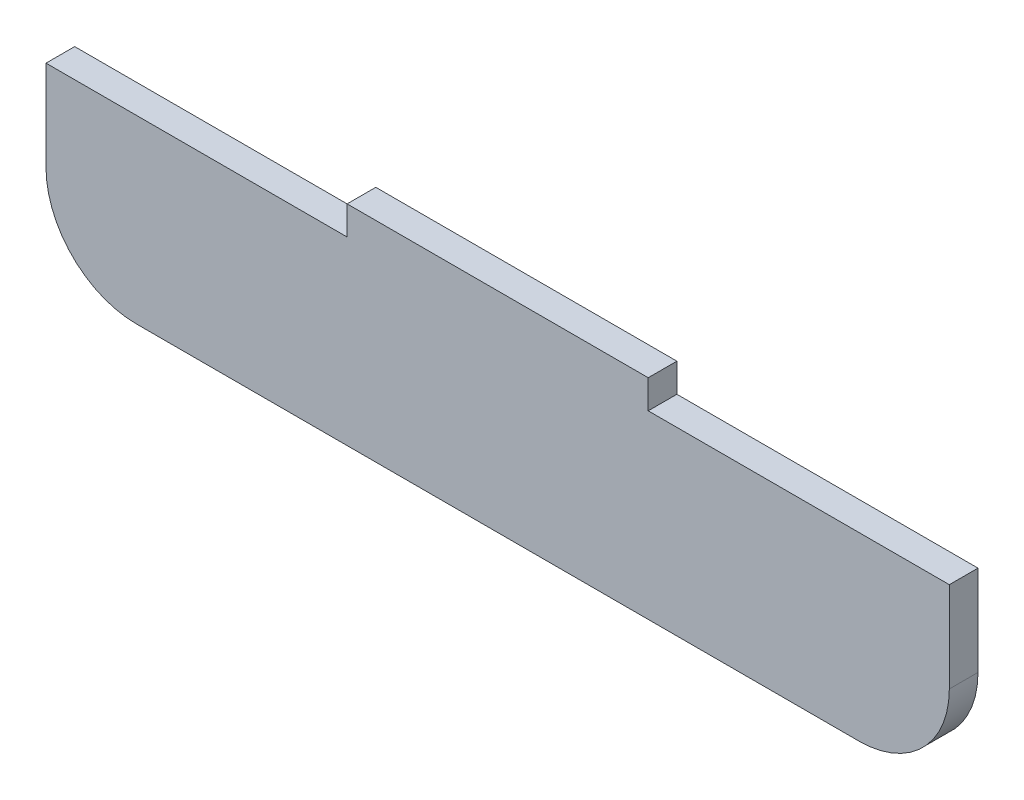
ISO-10303-21;
HEADER;
FILE_DESCRIPTION(('STEP AP214'),'2;1');
FILE_NAME('part.step','',(''),(''),'','','');
FILE_SCHEMA(('AUTOMOTIVE_DESIGN { 1 0 10303 214 1 1 1 1 }'));
ENDSEC;
DATA;
#1=APPLICATION_CONTEXT('core data for automotive mechanical design processes');
#2=APPLICATION_PROTOCOL_DEFINITION('international standard','automotive_design',2000,#1);
#3=PRODUCT_CONTEXT('',#1,'mechanical');
#4=PRODUCT('Part','Part','',(#3));
#5=PRODUCT_RELATED_PRODUCT_CATEGORY('part','',(#4));
#6=PRODUCT_DEFINITION_FORMATION('','',#4);
#7=PRODUCT_DEFINITION_CONTEXT('part definition',#1,'design');
#8=PRODUCT_DEFINITION('design','',#6,#7);
#9=PRODUCT_DEFINITION_SHAPE('','',#8);
#10=(LENGTH_UNIT() NAMED_UNIT(*) SI_UNIT(.MILLI.,.METRE.));
#11=(NAMED_UNIT(*) PLANE_ANGLE_UNIT() SI_UNIT($,.RADIAN.));
#12=(NAMED_UNIT(*) SI_UNIT($,.STERADIAN.) SOLID_ANGLE_UNIT());
#13=UNCERTAINTY_MEASURE_WITH_UNIT(LENGTH_MEASURE(1.E-05),#10,'distance_accuracy_value','');
#14=(GEOMETRIC_REPRESENTATION_CONTEXT(3) GLOBAL_UNCERTAINTY_ASSIGNED_CONTEXT((#13)) GLOBAL_UNIT_ASSIGNED_CONTEXT((#10,
#11,#12)) REPRESENTATION_CONTEXT('',''));
#15=CARTESIAN_POINT('',(0.,0.,0.));
#16=DIRECTION('',(0.,0.,1.));
#17=DIRECTION('',(1.,0.,0.));
#18=AXIS2_PLACEMENT_3D('',#15,#16,#17);
#19=CARTESIAN_POINT('',(0.,0.,3.175));
#20=DIRECTION('',(1.,0.,0.));
#21=DIRECTION('',(0.,0.,-1.));
#22=AXIS2_PLACEMENT_3D('',#19,#20,#21);
#23=PLANE('',#22);
#24=DIRECTION('',(0.,-1.,0.));
#25=VECTOR('',#24,1.);
#26=CARTESIAN_POINT('',(0.,0.,0.));
#27=LINE('',#26,#25);
#28=CARTESIAN_POINT('',(0.,20.,0.));
#29=VERTEX_POINT('',#28);
#30=CARTESIAN_POINT('',(0.,10.,0.));
#31=VERTEX_POINT('',#30);
#32=EDGE_CURVE('E145',#29,#31,#27,.T.);
#33=ORIENTED_EDGE('',*,*,#32,.T.);
#34=DIRECTION('',(0.,0.,-1.));
#35=VECTOR('',#34,1.);
#36=CARTESIAN_POINT('',(0.,10.,3.175));
#37=LINE('',#36,#35);
#38=CARTESIAN_POINT('',(0.,10.,3.175));
#39=VERTEX_POINT('',#38);
#40=EDGE_CURVE('E56',#31,#39,#37,.F.);
#41=ORIENTED_EDGE('',*,*,#40,.T.);
#42=DIRECTION('',(0.,-1.,0.));
#43=VECTOR('',#42,1.);
#44=CARTESIAN_POINT('',(0.,0.,3.175));
#45=LINE('',#44,#43);
#46=CARTESIAN_POINT('',(0.,20.,3.175));
#47=VERTEX_POINT('',#46);
#48=EDGE_CURVE('E161',#47,#39,#45,.T.);
#49=ORIENTED_EDGE('',*,*,#48,.F.);
#50=DIRECTION('',(0.,0.,-1.));
#51=VECTOR('',#50,1.);
#52=CARTESIAN_POINT('',(0.,20.,3.175));
#53=LINE('',#52,#51);
#54=EDGE_CURVE('E144',#47,#29,#53,.T.);
#55=ORIENTED_EDGE('',*,*,#54,.T.);
#56=EDGE_LOOP('',(#33,#41,#49,#55));
#57=FACE_BOUND('',#56,.T.);
#58=ADVANCED_FACE('F33',(#57),#23,.F.);
#59=CARTESIAN_POINT('',(0.,0.,3.175));
#60=DIRECTION('',(0.,1.,0.));
#61=DIRECTION('',(0.,0.,1.));
#62=AXIS2_PLACEMENT_3D('',#59,#60,#61);
#63=PLANE('',#62);
#64=DIRECTION('',(1.,0.,0.));
#65=VECTOR('',#64,1.);
#66=CARTESIAN_POINT('',(0.,0.,3.175));
#67=LINE('',#66,#65);
#68=CARTESIAN_POINT('',(10.,0.,3.175));
#69=VERTEX_POINT('',#68);
#70=CARTESIAN_POINT('',(90.,0.,3.175));
#71=VERTEX_POINT('',#70);
#72=EDGE_CURVE('E118',#69,#71,#67,.T.);
#73=ORIENTED_EDGE('',*,*,#72,.F.);
#74=DIRECTION('',(0.,0.,-1.));
#75=VECTOR('',#74,1.);
#76=CARTESIAN_POINT('',(10.,0.,3.175));
#77=LINE('',#76,#75);
#78=CARTESIAN_POINT('',(10.,0.,0.));
#79=VERTEX_POINT('',#78);
#80=EDGE_CURVE('E175',#69,#79,#77,.T.);
#81=ORIENTED_EDGE('',*,*,#80,.T.);
#82=DIRECTION('',(1.,0.,0.));
#83=VECTOR('',#82,1.);
#84=CARTESIAN_POINT('',(0.,0.,0.));
#85=LINE('',#84,#83);
#86=CARTESIAN_POINT('',(90.,0.,0.));
#87=VERTEX_POINT('',#86);
#88=EDGE_CURVE('E147',#79,#87,#85,.T.);
#89=ORIENTED_EDGE('',*,*,#88,.T.);
#90=DIRECTION('',(0.,0.,-1.));
#91=VECTOR('',#90,1.);
#92=CARTESIAN_POINT('',(90.,0.,3.175));
#93=LINE('',#92,#91);
#94=EDGE_CURVE('E127',#87,#71,#93,.F.);
#95=ORIENTED_EDGE('',*,*,#94,.T.);
#96=EDGE_LOOP('',(#73,#81,#89,#95));
#97=FACE_BOUND('',#96,.T.);
#98=ADVANCED_FACE('F188',(#97),#63,.F.);
#99=CARTESIAN_POINT('',(100.,0.,3.175));
#100=DIRECTION('',(-1.,0.,0.));
#101=DIRECTION('',(0.,0.,1.));
#102=AXIS2_PLACEMENT_3D('',#99,#100,#101);
#103=PLANE('',#102);
#104=DIRECTION('',(0.,1.,0.));
#105=VECTOR('',#104,1.);
#106=CARTESIAN_POINT('',(100.,0.,3.175));
#107=LINE('',#106,#105);
#108=CARTESIAN_POINT('',(100.,10.,3.175));
#109=VERTEX_POINT('',#108);
#110=CARTESIAN_POINT('',(100.,20.,3.175));
#111=VERTEX_POINT('',#110);
#112=EDGE_CURVE('E110',#109,#111,#107,.T.);
#113=ORIENTED_EDGE('',*,*,#112,.F.);
#114=DIRECTION('',(0.,0.,-1.));
#115=VECTOR('',#114,1.);
#116=CARTESIAN_POINT('',(100.,10.,3.175));
#117=LINE('',#116,#115);
#118=CARTESIAN_POINT('',(100.,10.,0.));
#119=VERTEX_POINT('',#118);
#120=EDGE_CURVE('E11',#109,#119,#117,.T.);
#121=ORIENTED_EDGE('',*,*,#120,.T.);
#122=DIRECTION('',(0.,1.,0.));
#123=VECTOR('',#122,1.);
#124=CARTESIAN_POINT('',(100.,0.,0.));
#125=LINE('',#124,#123);
#126=CARTESIAN_POINT('',(100.,20.,0.));
#127=VERTEX_POINT('',#126);
#128=EDGE_CURVE('E124',#119,#127,#125,.T.);
#129=ORIENTED_EDGE('',*,*,#128,.T.);
#130=DIRECTION('',(0.,0.,-1.));
#131=VECTOR('',#130,1.);
#132=CARTESIAN_POINT('',(100.,20.,3.175));
#133=LINE('',#132,#131);
#134=EDGE_CURVE('E121',#111,#127,#133,.T.);
#135=ORIENTED_EDGE('',*,*,#134,.F.);
#136=EDGE_LOOP('',(#113,#121,#129,#135));
#137=FACE_BOUND('',#136,.T.);
#138=ADVANCED_FACE('F122',(#137),#103,.F.);
#139=CARTESIAN_POINT('',(66.6666666666667,20.,3.175));
#140=DIRECTION('',(0.,-1.,0.));
#141=DIRECTION('',(0.,0.,-1.));
#142=AXIS2_PLACEMENT_3D('',#139,#140,#141);
#143=PLANE('',#142);
#144=DIRECTION('',(-1.,0.,0.));
#145=VECTOR('',#144,1.);
#146=CARTESIAN_POINT('',(66.6666666666667,20.,0.));
#147=LINE('',#146,#145);
#148=CARTESIAN_POINT('',(66.6666666666667,20.,0.));
#149=VERTEX_POINT('',#148);
#150=EDGE_CURVE('E151',#127,#149,#147,.T.);
#151=ORIENTED_EDGE('',*,*,#150,.T.);
#152=DIRECTION('',(0.,0.,-1.));
#153=VECTOR('',#152,1.);
#154=CARTESIAN_POINT('',(66.6666666666667,20.,3.175));
#155=LINE('',#154,#153);
#156=CARTESIAN_POINT('',(66.6666666666667,20.,3.175));
#157=VERTEX_POINT('',#156);
#158=EDGE_CURVE('E128',#157,#149,#155,.T.);
#159=ORIENTED_EDGE('',*,*,#158,.F.);
#160=DIRECTION('',(-1.,0.,0.));
#161=VECTOR('',#160,1.);
#162=CARTESIAN_POINT('',(66.6666666666667,20.,3.175));
#163=LINE('',#162,#161);
#164=EDGE_CURVE('E114',#111,#157,#163,.T.);
#165=ORIENTED_EDGE('',*,*,#164,.F.);
#166=ORIENTED_EDGE('',*,*,#134,.T.);
#167=EDGE_LOOP('',(#151,#159,#165,#166));
#168=FACE_BOUND('',#167,.T.);
#169=ADVANCED_FACE('F130',(#168),#143,.F.);
#170=CARTESIAN_POINT('',(66.6666666666667,23.175,3.175));
#171=DIRECTION('',(-1.,0.,0.));
#172=DIRECTION('',(0.,0.,1.));
#173=AXIS2_PLACEMENT_3D('',#170,#171,#172);
#174=PLANE('',#173);
#175=DIRECTION('',(0.,1.,0.));
#176=VECTOR('',#175,1.);
#177=CARTESIAN_POINT('',(66.6666666666667,23.175,0.));
#178=LINE('',#177,#176);
#179=CARTESIAN_POINT('',(66.6666666666667,23.175,0.));
#180=VERTEX_POINT('',#179);
#181=EDGE_CURVE('E153',#149,#180,#178,.T.);
#182=ORIENTED_EDGE('',*,*,#181,.T.);
#183=DIRECTION('',(0.,0.,-1.));
#184=VECTOR('',#183,1.);
#185=CARTESIAN_POINT('',(66.6666666666667,23.175,3.175));
#186=LINE('',#185,#184);
#187=CARTESIAN_POINT('',(66.6666666666667,23.175,3.175));
#188=VERTEX_POINT('',#187);
#189=EDGE_CURVE('E170',#188,#180,#186,.T.);
#190=ORIENTED_EDGE('',*,*,#189,.F.);
#191=DIRECTION('',(0.,1.,0.));
#192=VECTOR('',#191,1.);
#193=CARTESIAN_POINT('',(66.6666666666667,23.175,3.175));
#194=LINE('',#193,#192);
#195=EDGE_CURVE('E133',#157,#188,#194,.T.);
#196=ORIENTED_EDGE('',*,*,#195,.F.);
#197=ORIENTED_EDGE('',*,*,#158,.T.);
#198=EDGE_LOOP('',(#182,#190,#196,#197));
#199=FACE_BOUND('',#198,.T.);
#200=ADVANCED_FACE('F213',(#199),#174,.F.);
#201=CARTESIAN_POINT('',(33.3333333333333,23.175,3.175));
#202=DIRECTION('',(0.,-1.,0.));
#203=DIRECTION('',(0.,0.,-1.));
#204=AXIS2_PLACEMENT_3D('',#201,#202,#203);
#205=PLANE('',#204);
#206=DIRECTION('',(-1.,0.,0.));
#207=VECTOR('',#206,1.);
#208=CARTESIAN_POINT('',(33.3333333333333,23.175,0.));
#209=LINE('',#208,#207);
#210=CARTESIAN_POINT('',(33.3333333333333,23.175,0.));
#211=VERTEX_POINT('',#210);
#212=EDGE_CURVE('E155',#180,#211,#209,.T.);
#213=ORIENTED_EDGE('',*,*,#212,.T.);
#214=DIRECTION('',(0.,0.,-1.));
#215=VECTOR('',#214,1.);
#216=CARTESIAN_POINT('',(33.3333333333333,23.175,3.175));
#217=LINE('',#216,#215);
#218=CARTESIAN_POINT('',(33.3333333333333,23.175,3.175));
#219=VERTEX_POINT('',#218);
#220=EDGE_CURVE('E167',#219,#211,#217,.T.);
#221=ORIENTED_EDGE('',*,*,#220,.F.);
#222=DIRECTION('',(-1.,0.,0.));
#223=VECTOR('',#222,1.);
#224=CARTESIAN_POINT('',(33.3333333333333,23.175,3.175));
#225=LINE('',#224,#223);
#226=EDGE_CURVE('E135',#188,#219,#225,.T.);
#227=ORIENTED_EDGE('',*,*,#226,.F.);
#228=ORIENTED_EDGE('',*,*,#189,.T.);
#229=EDGE_LOOP('',(#213,#221,#227,#228));
#230=FACE_BOUND('',#229,.T.);
#231=ADVANCED_FACE('F210',(#230),#205,.F.);
#232=CARTESIAN_POINT('',(33.3333333333333,20.,3.175));
#233=DIRECTION('',(1.,0.,0.));
#234=DIRECTION('',(0.,0.,-1.));
#235=AXIS2_PLACEMENT_3D('',#232,#233,#234);
#236=PLANE('',#235);
#237=DIRECTION('',(0.,-1.,0.));
#238=VECTOR('',#237,1.);
#239=CARTESIAN_POINT('',(33.3333333333333,20.,0.));
#240=LINE('',#239,#238);
#241=CARTESIAN_POINT('',(33.3333333333333,20.,0.));
#242=VERTEX_POINT('',#241);
#243=EDGE_CURVE('E157',#211,#242,#240,.T.);
#244=ORIENTED_EDGE('',*,*,#243,.T.);
#245=DIRECTION('',(0.,0.,-1.));
#246=VECTOR('',#245,1.);
#247=CARTESIAN_POINT('',(33.3333333333333,20.,3.175));
#248=LINE('',#247,#246);
#249=CARTESIAN_POINT('',(33.3333333333333,20.,3.175));
#250=VERTEX_POINT('',#249);
#251=EDGE_CURVE('E164',#250,#242,#248,.T.);
#252=ORIENTED_EDGE('',*,*,#251,.F.);
#253=DIRECTION('',(0.,-1.,0.));
#254=VECTOR('',#253,1.);
#255=CARTESIAN_POINT('',(33.3333333333333,20.,3.175));
#256=LINE('',#255,#254);
#257=EDGE_CURVE('E140',#219,#250,#256,.T.);
#258=ORIENTED_EDGE('',*,*,#257,.F.);
#259=ORIENTED_EDGE('',*,*,#220,.T.);
#260=EDGE_LOOP('',(#244,#252,#258,#259));
#261=FACE_BOUND('',#260,.T.);
#262=ADVANCED_FACE('F205',(#261),#236,.F.);
#263=CARTESIAN_POINT('',(0.,20.,3.175));
#264=DIRECTION('',(0.,-1.,0.));
#265=DIRECTION('',(0.,0.,-1.));
#266=AXIS2_PLACEMENT_3D('',#263,#264,#265);
#267=PLANE('',#266);
#268=DIRECTION('',(-1.,0.,0.));
#269=VECTOR('',#268,1.);
#270=CARTESIAN_POINT('',(0.,20.,0.));
#271=LINE('',#270,#269);
#272=EDGE_CURVE('E159',#242,#29,#271,.T.);
#273=ORIENTED_EDGE('',*,*,#272,.T.);
#274=ORIENTED_EDGE('',*,*,#54,.F.);
#275=DIRECTION('',(-1.,0.,0.));
#276=VECTOR('',#275,1.);
#277=CARTESIAN_POINT('',(0.,20.,3.175));
#278=LINE('',#277,#276);
#279=EDGE_CURVE('E142',#250,#47,#278,.T.);
#280=ORIENTED_EDGE('',*,*,#279,.F.);
#281=ORIENTED_EDGE('',*,*,#251,.T.);
#282=EDGE_LOOP('',(#273,#274,#280,#281));
#283=FACE_BOUND('',#282,.T.);
#284=ADVANCED_FACE('F199',(#283),#267,.F.);
#285=CARTESIAN_POINT('',(0.,0.,3.175));
#286=DIRECTION('',(0.,0.,-1.));
#287=DIRECTION('',(-1.,0.,0.));
#288=AXIS2_PLACEMENT_3D('',#285,#286,#287);
#289=PLANE('',#288);
#290=ORIENTED_EDGE('',*,*,#48,.T.);
#291=CARTESIAN_POINT('',(10.,10.,3.175));
#292=DIRECTION('',(0.,0.,-1.));
#293=DIRECTION('',(-1.,0.,0.));
#294=AXIS2_PLACEMENT_3D('',#291,#292,#293);
#295=CIRCLE('',#294,10.);
#296=EDGE_CURVE('E41',#39,#69,#295,.F.);
#297=ORIENTED_EDGE('',*,*,#296,.T.);
#298=ORIENTED_EDGE('',*,*,#72,.T.);
#299=CARTESIAN_POINT('',(90.,10.,3.175));
#300=DIRECTION('',(0.,0.,-1.));
#301=DIRECTION('',(-1.,0.,0.));
#302=AXIS2_PLACEMENT_3D('',#299,#300,#301);
#303=CIRCLE('',#302,10.);
#304=EDGE_CURVE('E48',#71,#109,#303,.F.);
#305=ORIENTED_EDGE('',*,*,#304,.T.);
#306=ORIENTED_EDGE('',*,*,#112,.T.);
#307=ORIENTED_EDGE('',*,*,#164,.T.);
#308=ORIENTED_EDGE('',*,*,#195,.T.);
#309=ORIENTED_EDGE('',*,*,#226,.T.);
#310=ORIENTED_EDGE('',*,*,#257,.T.);
#311=ORIENTED_EDGE('',*,*,#279,.T.);
#312=EDGE_LOOP('',(#290,#297,#298,#305,#306,#307,#308,#309,#310,#311));
#313=FACE_BOUND('',#312,.T.);
#314=ADVANCED_FACE('F112',(#313),#289,.F.);
#315=CARTESIAN_POINT('',(0.,0.,0.));
#316=DIRECTION('',(0.,0.,-1.));
#317=DIRECTION('',(-1.,0.,0.));
#318=AXIS2_PLACEMENT_3D('',#315,#316,#317);
#319=PLANE('',#318);
#320=ORIENTED_EDGE('',*,*,#88,.F.);
#321=CARTESIAN_POINT('',(10.,10.,0.));
#322=DIRECTION('',(0.,0.,-1.));
#323=DIRECTION('',(-1.,0.,0.));
#324=AXIS2_PLACEMENT_3D('',#321,#322,#323);
#325=CIRCLE('',#324,10.);
#326=EDGE_CURVE('E180',#79,#31,#325,.T.);
#327=ORIENTED_EDGE('',*,*,#326,.T.);
#328=ORIENTED_EDGE('',*,*,#32,.F.);
#329=ORIENTED_EDGE('',*,*,#272,.F.);
#330=ORIENTED_EDGE('',*,*,#243,.F.);
#331=ORIENTED_EDGE('',*,*,#212,.F.);
#332=ORIENTED_EDGE('',*,*,#181,.F.);
#333=ORIENTED_EDGE('',*,*,#150,.F.);
#334=ORIENTED_EDGE('',*,*,#128,.F.);
#335=CARTESIAN_POINT('',(90.,10.,0.));
#336=DIRECTION('',(0.,0.,-1.));
#337=DIRECTION('',(-1.,0.,0.));
#338=AXIS2_PLACEMENT_3D('',#335,#336,#337);
#339=CIRCLE('',#338,10.);
#340=EDGE_CURVE('E178',#119,#87,#339,.T.);
#341=ORIENTED_EDGE('',*,*,#340,.T.);
#342=EDGE_LOOP('',(#320,#327,#328,#329,#330,#331,#332,#333,#334,#341));
#343=FACE_BOUND('',#342,.T.);
#344=ADVANCED_FACE('F194',(#343),#319,.T.);
#345=CARTESIAN_POINT('',(10.,10.,3.175));
#346=DIRECTION('',(0.,0.,-1.));
#347=DIRECTION('',(-1.,0.,0.));
#348=AXIS2_PLACEMENT_3D('',#345,#346,#347);
#349=CYLINDRICAL_SURFACE('',#348,10.);
#350=ORIENTED_EDGE('',*,*,#296,.F.);
#351=ORIENTED_EDGE('',*,*,#40,.F.);
#352=ORIENTED_EDGE('',*,*,#326,.F.);
#353=ORIENTED_EDGE('',*,*,#80,.F.);
#354=EDGE_LOOP('',(#350,#351,#352,#353));
#355=FACE_BOUND('',#354,.T.);
#356=ADVANCED_FACE('F191',(#355),#349,.T.);
#357=CARTESIAN_POINT('',(90.,10.,3.175));
#358=DIRECTION('',(0.,0.,-1.));
#359=DIRECTION('',(-1.,0.,0.));
#360=AXIS2_PLACEMENT_3D('',#357,#358,#359);
#361=CYLINDRICAL_SURFACE('',#360,10.);
#362=ORIENTED_EDGE('',*,*,#304,.F.);
#363=ORIENTED_EDGE('',*,*,#94,.F.);
#364=ORIENTED_EDGE('',*,*,#340,.F.);
#365=ORIENTED_EDGE('',*,*,#120,.F.);
#366=EDGE_LOOP('',(#362,#363,#364,#365));
#367=FACE_BOUND('',#366,.T.);
#368=ADVANCED_FACE('F35',(#367),#361,.T.);
#369=CLOSED_SHELL('',(#58,#98,#138,#169,#200,#231,#262,#284,#314,#344,#356,#368));
#370=MANIFOLD_SOLID_BREP('B2',#369);
#371=ADVANCED_BREP_SHAPE_REPRESENTATION('',(#18,#370),#14);
#372=SHAPE_DEFINITION_REPRESENTATION(#9,#371);
ENDSEC;
END-ISO-10303-21;
